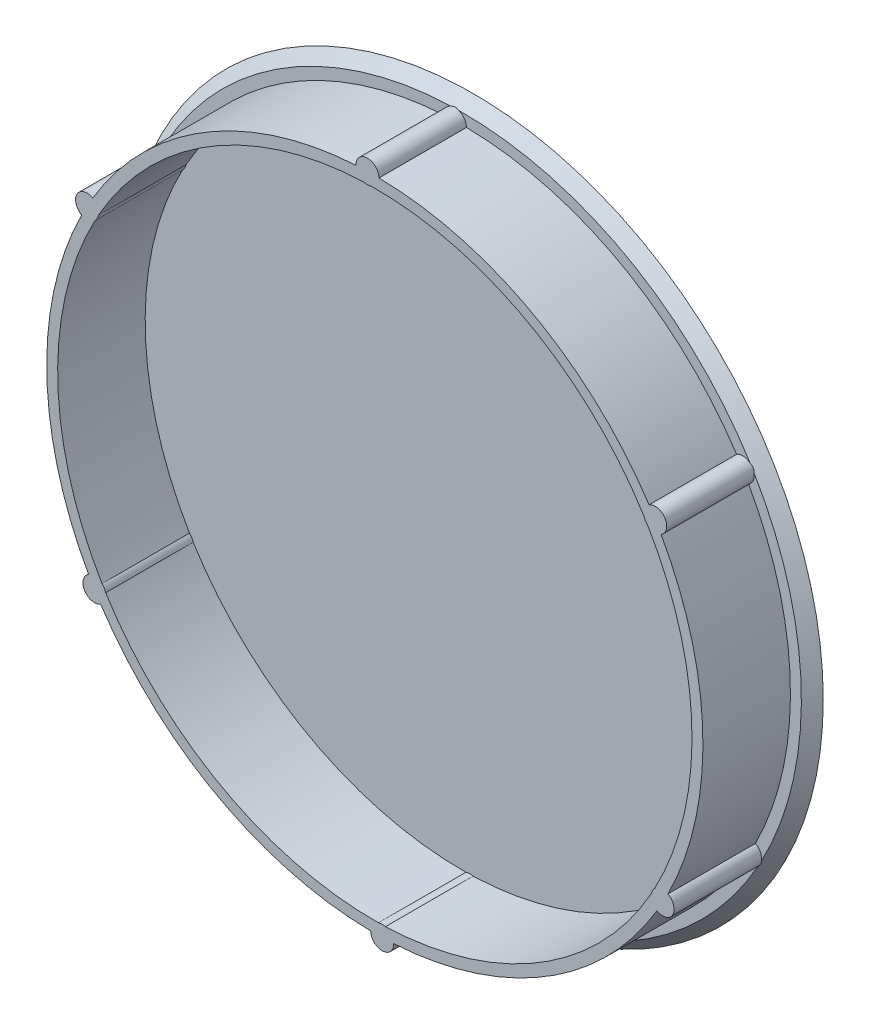
ISO-10303-21;
HEADER;
FILE_DESCRIPTION(('STEP AP214'),'2;1');
FILE_NAME('part.step','',(''),(''),'','','');
FILE_SCHEMA(('AUTOMOTIVE_DESIGN { 1 0 10303 214 1 1 1 1 }'));
ENDSEC;
DATA;
#1=APPLICATION_CONTEXT('core data for automotive mechanical design processes');
#2=APPLICATION_PROTOCOL_DEFINITION('international standard','automotive_design',2000,#1);
#3=PRODUCT_CONTEXT('',#1,'mechanical');
#4=PRODUCT('Part','Part','',(#3));
#5=PRODUCT_RELATED_PRODUCT_CATEGORY('part','',(#4));
#6=PRODUCT_DEFINITION_FORMATION('','',#4);
#7=PRODUCT_DEFINITION_CONTEXT('part definition',#1,'design');
#8=PRODUCT_DEFINITION('design','',#6,#7);
#9=PRODUCT_DEFINITION_SHAPE('','',#8);
#10=(LENGTH_UNIT() NAMED_UNIT(*) SI_UNIT(.MILLI.,.METRE.));
#11=(NAMED_UNIT(*) PLANE_ANGLE_UNIT() SI_UNIT($,.RADIAN.));
#12=(NAMED_UNIT(*) SI_UNIT($,.STERADIAN.) SOLID_ANGLE_UNIT());
#13=UNCERTAINTY_MEASURE_WITH_UNIT(LENGTH_MEASURE(1.E-05),#10,'distance_accuracy_value','');
#14=(GEOMETRIC_REPRESENTATION_CONTEXT(3) GLOBAL_UNCERTAINTY_ASSIGNED_CONTEXT((#13)) GLOBAL_UNIT_ASSIGNED_CONTEXT((#10,
#11,#12)) REPRESENTATION_CONTEXT('',''));
#15=CARTESIAN_POINT('',(0.,0.,0.));
#16=DIRECTION('',(0.,0.,1.));
#17=DIRECTION('',(1.,0.,0.));
#18=AXIS2_PLACEMENT_3D('',#15,#16,#17);
#19=CARTESIAN_POINT('',(-36.0124263888669,0.,-8.18963149384611));
#20=DIRECTION('',(0.,0.,1.));
#21=DIRECTION('',(1.,0.,0.));
#22=AXIS2_PLACEMENT_3D('',#19,#20,#21);
#23=PLANE('',#22);
#24=CARTESIAN_POINT('',(19.624258490425,15.5807698269335,-8.18963149384611));
#25=DIRECTION('',(0.,0.,1.));
#26=DIRECTION('',(1.,0.,0.));
#27=AXIS2_PLACEMENT_3D('',#24,#25,#26);
#28=CIRCLE('',#27,1.05187214555238);
#29=CARTESIAN_POINT('',(19.0622846736642,16.4699382248562,-8.18963149384611));
#30=VERTEX_POINT('',#29);
#31=CARTESIAN_POINT('',(20.3050627468088,16.3826055801141,-8.18963149384611));
#32=VERTEX_POINT('',#31);
#33=EDGE_CURVE('E506',#30,#32,#28,.F.);
#34=ORIENTED_EDGE('',*,*,#33,.T.);
#35=CARTESIAN_POINT('',(-6.01242638886693,0.,-8.18963149384611));
#36=DIRECTION('',(0.,0.,1.));
#37=DIRECTION('',(1.,0.,0.));
#38=AXIS2_PLACEMENT_3D('',#35,#36,#37);
#39=CIRCLE('',#38,31.);
#40=CARTESIAN_POINT('',(-6.37833860260875,30.9978403804496,-8.18963149384611));
#41=VERTEX_POINT('',#40);
#42=EDGE_CURVE('E332',#32,#41,#39,.T.);
#43=ORIENTED_EDGE('',*,*,#42,.T.);
#44=CARTESIAN_POINT('',(-6.68742642986354,29.99240528775,-8.18963149384611));
#45=DIRECTION('',(0.,0.,1.));
#46=DIRECTION('',(1.,0.,0.));
#47=AXIS2_PLACEMENT_3D('',#44,#45,#46);
#48=CIRCLE('',#47,1.05187214555238);
#49=CARTESIAN_POINT('',(-5.6355672743315,29.997632860074,-8.18963149384611));
#50=VERTEX_POINT('',#49);
#51=EDGE_CURVE('E519',#41,#50,#48,.F.);
#52=ORIENTED_EDGE('',*,*,#51,.T.);
#53=CARTESIAN_POINT('',(-6.01242638886693,0.,-8.18963149384611));
#54=DIRECTION('',(0.,0.,-1.));
#55=DIRECTION('',(-1.,0.,0.));
#56=AXIS2_PLACEMENT_3D('',#53,#54,#55);
#57=CIRCLE('',#56,30.);
#58=EDGE_CURVE('E527',#50,#30,#57,.T.);
#59=ORIENTED_EDGE('',*,*,#58,.T.);
#60=EDGE_LOOP('',(#34,#43,#52,#59));
#61=FACE_BOUND('',#60,.T.);
#62=ADVANCED_FACE('F37',(#61),#23,.T.);
#63=CARTESIAN_POINT('',(-7.73845575908724,29.9503058851347,-8.18963149384611));
#64=VERTEX_POINT('',#63);
#65=CARTESIAN_POINT('',(-7.04143443358864,30.9829169453733,-8.18963149384611));
#66=VERTEX_POINT('',#65);
#67=EDGE_CURVE('E522',#64,#66,#48,.F.);
#68=ORIENTED_EDGE('',*,*,#67,.T.);
#69=CARTESIAN_POINT('',(-6.01242638886693,0.,-8.18963149384611));
#70=DIRECTION('',(0.,0.,1.));
#71=DIRECTION('',(1.,0.,0.));
#72=AXIS2_PLACEMENT_3D('',#69,#70,#71);
#73=CIRCLE('',#72,31.);
#74=CARTESIAN_POINT('',(-33.0402997276621,15.1820309175697,-8.18963149384611));
#75=VERTEX_POINT('',#74);
#76=EDGE_CURVE('E330',#66,#75,#73,.T.);
#77=ORIENTED_EDGE('',*,*,#76,.T.);
#78=CARTESIAN_POINT('',(-32.3241113091553,14.4116354608167,-8.18963149384611));
#79=DIRECTION('',(0.,0.,1.));
#80=DIRECTION('',(1.,0.,0.));
#81=AXIS2_PLACEMENT_3D('',#78,#79,#80);
#82=CIRCLE('',#81,1.05187214555238);
#83=CARTESIAN_POINT('',(-31.8027089418219,15.3251859968728,-8.18963149384611));
#84=VERTEX_POINT('',#83);
#85=EDGE_CURVE('E271',#75,#84,#82,.F.);
#86=ORIENTED_EDGE('',*,*,#85,.T.);
#87=EDGE_CURVE('E526',#84,#64,#57,.T.);
#88=ORIENTED_EDGE('',*,*,#87,.T.);
#89=EDGE_LOOP('',(#68,#77,#86,#88));
#90=FACE_BOUND('',#89,.T.);
#91=ADVANCED_FACE('F387',(#90),#23,.T.);
#92=CARTESIAN_POINT('',(-32.8131668216182,13.4803676602788,-8.18963149384611));
#93=VERTEX_POINT('',#92);
#94=CARTESIAN_POINT('',(-33.3589235692642,14.6003113652594,-8.18963149384611));
#95=VERTEX_POINT('',#94);
#96=EDGE_CURVE('E269',#93,#95,#82,.F.);
#97=ORIENTED_EDGE('',*,*,#96,.T.);
#98=CARTESIAN_POINT('',(-6.01242638886693,0.,-8.18963149384611));
#99=DIRECTION('',(0.,0.,1.));
#100=DIRECTION('',(1.,0.,0.));
#101=AXIS2_PLACEMENT_3D('',#98,#99,#100);
#102=CIRCLE('',#101,31.);
#103=CARTESIAN_POINT('',(-32.6743875139206,-15.81580946288,-8.18963149384611));
#104=VERTEX_POINT('',#103);
#105=EDGE_CURVE('E59',#95,#104,#102,.T.);
#106=ORIENTED_EDGE('',*,*,#105,.T.);
#107=CARTESIAN_POINT('',(-31.649111268159,-15.5807698269334,-8.18963149384611));
#108=DIRECTION('',(0.,0.,1.));
#109=DIRECTION('',(1.,0.,0.));
#110=AXIS2_PLACEMENT_3D('',#107,#108,#109);
#111=CIRCLE('',#110,1.05187214555238);
#112=CARTESIAN_POINT('',(-32.1795680563578,-14.6724468632013,-8.18963149384611));
#113=VERTEX_POINT('',#112);
#114=EDGE_CURVE('E548',#104,#113,#111,.F.);
#115=ORIENTED_EDGE('',*,*,#114,.T.);
#116=EDGE_CURVE('E457',#113,#93,#57,.T.);
#117=ORIENTED_EDGE('',*,*,#116,.T.);
#118=EDGE_LOOP('',(#97,#106,#115,#117));
#119=FACE_BOUND('',#118,.T.);
#120=ADVANCED_FACE('F397',(#119),#23,.T.);
#121=CARTESIAN_POINT('',(-31.0871374513982,-16.469938224856,-8.18963149384611));
#122=VERTEX_POINT('',#121);
#123=CARTESIAN_POINT('',(-32.3299155245428,-16.3826055801139,-8.18963149384611));
#124=VERTEX_POINT('',#123);
#125=EDGE_CURVE('E461',#122,#124,#111,.F.);
#126=ORIENTED_EDGE('',*,*,#125,.T.);
#127=CARTESIAN_POINT('',(-6.01242638886693,0.,-8.18963149384611));
#128=DIRECTION('',(0.,0.,1.));
#129=DIRECTION('',(1.,0.,0.));
#130=AXIS2_PLACEMENT_3D('',#127,#128,#129);
#131=CIRCLE('',#130,31.);
#132=CARTESIAN_POINT('',(-5.64651417512511,-30.9978403804496,-8.18963149384611));
#133=VERTEX_POINT('',#132);
#134=EDGE_CURVE('E327',#124,#133,#131,.T.);
#135=ORIENTED_EDGE('',*,*,#134,.T.);
#136=CARTESIAN_POINT('',(-5.33742634787033,-29.99240528775,-8.18963149384611));
#137=DIRECTION('',(0.,0.,1.));
#138=DIRECTION('',(1.,0.,0.));
#139=AXIS2_PLACEMENT_3D('',#136,#137,#138);
#140=CIRCLE('',#139,1.05187214555238);
#141=CARTESIAN_POINT('',(-6.38928550340247,-29.997632860074,-8.18963149384611));
#142=VERTEX_POINT('',#141);
#143=EDGE_CURVE('E410',#133,#142,#140,.F.);
#144=ORIENTED_EDGE('',*,*,#143,.T.);
#145=EDGE_CURVE('E536',#142,#122,#57,.T.);
#146=ORIENTED_EDGE('',*,*,#145,.T.);
#147=EDGE_LOOP('',(#126,#135,#144,#146));
#148=FACE_BOUND('',#147,.T.);
#149=ADVANCED_FACE('F390',(#148),#23,.T.);
#150=CARTESIAN_POINT('',(-4.28639701864663,-29.9503058851347,-8.18963149384611));
#151=VERTEX_POINT('',#150);
#152=CARTESIAN_POINT('',(-4.98341834414522,-30.9829169453733,-8.18963149384611));
#153=VERTEX_POINT('',#152);
#154=EDGE_CURVE('E401',#151,#153,#140,.F.);
#155=ORIENTED_EDGE('',*,*,#154,.T.);
#156=CARTESIAN_POINT('',(-6.01242638886693,0.,-8.18963149384611));
#157=DIRECTION('',(0.,0.,1.));
#158=DIRECTION('',(1.,0.,0.));
#159=AXIS2_PLACEMENT_3D('',#156,#157,#158);
#160=CIRCLE('',#159,31.);
#161=CARTESIAN_POINT('',(21.0154469499284,-15.1820309175695,-8.18963149384611));
#162=VERTEX_POINT('',#161);
#163=EDGE_CURVE('E325',#153,#162,#160,.T.);
#164=ORIENTED_EDGE('',*,*,#163,.T.);
#165=CARTESIAN_POINT('',(20.2992585314215,-14.4116354608165,-8.18963149384611));
#166=DIRECTION('',(0.,0.,1.));
#167=DIRECTION('',(1.,0.,0.));
#168=AXIS2_PLACEMENT_3D('',#165,#166,#167);
#169=CIRCLE('',#168,1.05187214555238);
#170=CARTESIAN_POINT('',(19.7778561640882,-15.3251859968726,-8.18963149384611));
#171=VERTEX_POINT('',#170);
#172=EDGE_CURVE('E485',#162,#171,#169,.F.);
#173=ORIENTED_EDGE('',*,*,#172,.T.);
#174=EDGE_CURVE('E405',#171,#151,#57,.T.);
#175=ORIENTED_EDGE('',*,*,#174,.T.);
#176=EDGE_LOOP('',(#155,#164,#173,#175));
#177=FACE_BOUND('',#176,.T.);
#178=ADVANCED_FACE('F379',(#177),#23,.T.);
#179=CARTESIAN_POINT('',(-6.01242638886693,0.,-9.18963149384611));
#180=DIRECTION('',(0.,0.,-1.));
#181=DIRECTION('',(-1.,0.,0.));
#182=AXIS2_PLACEMENT_3D('',#179,#180,#181);
#183=CYLINDRICAL_SURFACE('',#182,29.);
#184=DIRECTION('',(0.,0.,1.));
#185=VECTOR('',#184,1.);
#186=CARTESIAN_POINT('',(-31.2914123212657,14.2117159495108,-4.18963149384611));
#187=LINE('',#186,#185);
#188=CARTESIAN_POINT('',(-31.2914123212657,14.2117159495108,-8.18963149384611));
#189=VERTEX_POINT('',#188);
#190=CARTESIAN_POINT('',(-31.2914123212658,14.2117159495108,-0.189631493846106));
#191=VERTEX_POINT('',#190);
#192=EDGE_CURVE('E257',#189,#191,#187,.T.);
#193=ORIENTED_EDGE('',*,*,#192,.F.);
#194=CARTESIAN_POINT('',(-6.01242638886693,0.,-8.18963149384611));
#195=DIRECTION('',(0.,0.,-1.));
#196=DIRECTION('',(-1.,0.,0.));
#197=AXIS2_PLACEMENT_3D('',#194,#195,#196);
#198=CIRCLE('',#197,29.);
#199=CARTESIAN_POINT('',(-6.9855607193096,28.9836679800006,-8.18963149384611));
#200=VERTEX_POINT('',#199);
#201=EDGE_CURVE('E241',#189,#200,#198,.T.);
#202=ORIENTED_EDGE('',*,*,#201,.T.);
#203=DIRECTION('',(0.,0.,1.));
#204=VECTOR('',#203,1.);
#205=CARTESIAN_POINT('',(-6.98556071930954,28.9836679800006,-4.18963149384611));
#206=LINE('',#205,#204);
#207=CARTESIAN_POINT('',(-6.98556071930954,28.9836679800006,-0.189631493846105));
#208=VERTEX_POINT('',#207);
#209=EDGE_CURVE('E521',#208,#200,#206,.F.);
#210=ORIENTED_EDGE('',*,*,#209,.F.);
#211=CARTESIAN_POINT('',(-6.01242638886693,0.,-0.189631493846106));
#212=DIRECTION('',(0.,0.,-1.));
#213=DIRECTION('',(-1.,0.,0.));
#214=AXIS2_PLACEMENT_3D('',#211,#212,#213);
#215=CIRCLE('',#214,29.);
#216=EDGE_CURVE('E259',#191,#208,#215,.T.);
#217=ORIENTED_EDGE('',*,*,#216,.F.);
#218=EDGE_LOOP('',(#193,#202,#210,#217));
#219=FACE_BOUND('',#218,.T.);
#220=ADVANCED_FACE('F258',(#219),#183,.F.);
#221=CARTESIAN_POINT('',(-6.01242638886693,0.,-9.18963149384611));
#222=DIRECTION('',(0.,0.,-1.));
#223=DIRECTION('',(-1.,0.,0.));
#224=AXIS2_PLACEMENT_3D('',#221,#222,#223);
#225=CYLINDRICAL_SURFACE('',#224,30.);
#226=DIRECTION('',(0.,0.,1.));
#227=VECTOR('',#226,1.);
#228=CARTESIAN_POINT('',(-31.802708941822,15.3251859968727,-4.18963149384611));
#229=LINE('',#228,#227);
#230=CARTESIAN_POINT('',(-31.8027089418219,15.3251859968728,-0.189631493846106));
#231=VERTEX_POINT('',#230);
#232=EDGE_CURVE('E273',#231,#84,#229,.F.);
#233=ORIENTED_EDGE('',*,*,#232,.F.);
#234=CARTESIAN_POINT('',(-6.01242638886693,0.,-0.189631493846106));
#235=DIRECTION('',(0.,0.,-1.));
#236=DIRECTION('',(-1.,0.,0.));
#237=AXIS2_PLACEMENT_3D('',#234,#235,#236);
#238=CIRCLE('',#237,30.);
#239=CARTESIAN_POINT('',(-7.73845575908724,29.9503058851347,-0.189631493846106));
#240=VERTEX_POINT('',#239);
#241=EDGE_CURVE('E529',#231,#240,#238,.T.);
#242=ORIENTED_EDGE('',*,*,#241,.T.);
#243=DIRECTION('',(0.,0.,1.));
#244=VECTOR('',#243,1.);
#245=CARTESIAN_POINT('',(-7.73845575908724,29.9503058851347,-4.18963149384611));
#246=LINE('',#245,#244);
#247=EDGE_CURVE('E307',#64,#240,#246,.T.);
#248=ORIENTED_EDGE('',*,*,#247,.F.);
#249=ORIENTED_EDGE('',*,*,#87,.F.);
#250=EDGE_LOOP('',(#233,#242,#248,#249));
#251=FACE_BOUND('',#250,.T.);
#252=ADVANCED_FACE('F362',(#251),#225,.T.);
#253=DIRECTION('',(0.,0.,1.));
#254=VECTOR('',#253,1.);
#255=CARTESIAN_POINT('',(-31.5995863196221,13.6490749385427,-4.18963149384611));
#256=LINE('',#255,#254);
#257=CARTESIAN_POINT('',(-31.5995863196221,13.6490749385427,-0.189631493846106));
#258=VERTEX_POINT('',#257);
#259=CARTESIAN_POINT('',(-31.5995863196221,13.6490749385427,-8.18963149384611));
#260=VERTEX_POINT('',#259);
#261=EDGE_CURVE('E264',#258,#260,#256,.F.);
#262=ORIENTED_EDGE('',*,*,#261,.F.);
#263=CARTESIAN_POINT('',(-30.9596263987113,-14.7863860246114,-0.189631493846106));
#264=VERTEX_POINT('',#263);
#265=EDGE_CURVE('E291',#264,#258,#215,.T.);
#266=ORIENTED_EDGE('',*,*,#265,.F.);
#267=DIRECTION('',(0.,0.,1.));
#268=VECTOR('',#267,1.);
#269=CARTESIAN_POINT('',(-30.9596263987113,-14.7863860246113,-4.18963149384611));
#270=LINE('',#269,#268);
#271=CARTESIAN_POINT('',(-30.9596263987113,-14.7863860246113,-8.18963149384611));
#272=VERTEX_POINT('',#271);
#273=EDGE_CURVE('E826',#272,#264,#270,.T.);
#274=ORIENTED_EDGE('',*,*,#273,.F.);
#275=EDGE_CURVE('E252',#272,#260,#198,.T.);
#276=ORIENTED_EDGE('',*,*,#275,.T.);
#277=EDGE_LOOP('',(#262,#266,#274,#276));
#278=FACE_BOUND('',#277,.T.);
#279=ADVANCED_FACE('F396',(#278),#183,.F.);
#280=DIRECTION('',(0.,0.,1.));
#281=VECTOR('',#280,1.);
#282=CARTESIAN_POINT('',(-32.8131668216182,13.4803676602788,-4.18963149384611));
#283=LINE('',#282,#281);
#284=CARTESIAN_POINT('',(-32.8131668216182,13.4803676602787,-0.189631493846106));
#285=VERTEX_POINT('',#284);
#286=EDGE_CURVE('E268',#93,#285,#283,.T.);
#287=ORIENTED_EDGE('',*,*,#286,.F.);
#288=ORIENTED_EDGE('',*,*,#116,.F.);
#289=DIRECTION('',(0.,0.,1.));
#290=VECTOR('',#289,1.);
#291=CARTESIAN_POINT('',(-32.1795680563577,-14.6724468632014,-4.18963149384611));
#292=LINE('',#291,#290);
#293=CARTESIAN_POINT('',(-32.1795680563578,-14.6724468632013,-0.189631493846106));
#294=VERTEX_POINT('',#293);
#295=EDGE_CURVE('E546',#294,#113,#292,.F.);
#296=ORIENTED_EDGE('',*,*,#295,.F.);
#297=EDGE_CURVE('E533',#294,#285,#238,.T.);
#298=ORIENTED_EDGE('',*,*,#297,.T.);
#299=EDGE_LOOP('',(#287,#288,#296,#298));
#300=FACE_BOUND('',#299,.T.);
#301=ADVANCED_FACE('F764',(#300),#225,.T.);
#302=DIRECTION('',(0.,0.,1.));
#303=VECTOR('',#302,1.);
#304=CARTESIAN_POINT('',(-30.6264519891799,-15.3345930414581,-4.18963149384611));
#305=LINE('',#304,#303);
#306=CARTESIAN_POINT('',(-30.6264519891799,-15.3345930414581,-0.189631493846106));
#307=VERTEX_POINT('',#306);
#308=CARTESIAN_POINT('',(-30.6264519891799,-15.3345930414581,-8.18963149384611));
#309=VERTEX_POINT('',#308);
#310=EDGE_CURVE('E827',#307,#309,#305,.F.);
#311=ORIENTED_EDGE('',*,*,#310,.F.);
#312=CARTESIAN_POINT('',(-5.68064046631221,-28.9981019741223,-0.189631493846106));
#313=VERTEX_POINT('',#312);
#314=EDGE_CURVE('E297',#313,#307,#215,.T.);
#315=ORIENTED_EDGE('',*,*,#314,.F.);
#316=DIRECTION('',(0.,0.,1.));
#317=VECTOR('',#316,1.);
#318=CARTESIAN_POINT('',(-5.68064046631222,-28.9981019741223,-4.18963149384611));
#319=LINE('',#318,#317);
#320=CARTESIAN_POINT('',(-5.68064046631222,-28.9981019741223,-8.18963149384611));
#321=VERTEX_POINT('',#320);
#322=EDGE_CURVE('E478',#321,#313,#319,.T.);
#323=ORIENTED_EDGE('',*,*,#322,.F.);
#324=EDGE_CURVE('E835',#321,#309,#198,.T.);
#325=ORIENTED_EDGE('',*,*,#324,.T.);
#326=EDGE_LOOP('',(#311,#315,#323,#325));
#327=FACE_BOUND('',#326,.T.);
#328=ADVANCED_FACE('F756',(#327),#183,.F.);
#329=DIRECTION('',(0.,0.,1.));
#330=VECTOR('',#329,1.);
#331=CARTESIAN_POINT('',(-31.0871374513982,-16.469938224856,-4.18963149384611));
#332=LINE('',#331,#330);
#333=CARTESIAN_POINT('',(-31.0871374513981,-16.4699382248561,-0.189631493846106));
#334=VERTEX_POINT('',#333);
#335=EDGE_CURVE('E540',#122,#334,#332,.T.);
#336=ORIENTED_EDGE('',*,*,#335,.F.);
#337=ORIENTED_EDGE('',*,*,#145,.F.);
#338=DIRECTION('',(0.,0.,1.));
#339=VECTOR('',#338,1.);
#340=CARTESIAN_POINT('',(-6.38928550340236,-29.997632860074,-4.18963149384611));
#341=LINE('',#340,#339);
#342=CARTESIAN_POINT('',(-6.38928550340247,-29.997632860074,-0.189631493846106));
#343=VERTEX_POINT('',#342);
#344=EDGE_CURVE('E464',#343,#142,#341,.F.);
#345=ORIENTED_EDGE('',*,*,#344,.F.);
#346=EDGE_CURVE('E543',#343,#334,#238,.T.);
#347=ORIENTED_EDGE('',*,*,#346,.T.);
#348=EDGE_LOOP('',(#336,#337,#345,#347));
#349=FACE_BOUND('',#348,.T.);
#350=ADVANCED_FACE('F541',(#349),#225,.T.);
#351=DIRECTION('',(0.,0.,1.));
#352=VECTOR('',#351,1.);
#353=CARTESIAN_POINT('',(-5.03929205842433,-28.9836679800006,-4.18963149384611));
#354=LINE('',#353,#352);
#355=CARTESIAN_POINT('',(-5.03929205842433,-28.9836679800006,-0.189631493846106));
#356=VERTEX_POINT('',#355);
#357=CARTESIAN_POINT('',(-5.03929205842433,-28.9836679800006,-8.18963149384611));
#358=VERTEX_POINT('',#357);
#359=EDGE_CURVE('E473',#356,#358,#354,.F.);
#360=ORIENTED_EDGE('',*,*,#359,.F.);
#361=CARTESIAN_POINT('',(19.266559543532,-14.2117159495107,-0.189631493846106));
#362=VERTEX_POINT('',#361);
#363=EDGE_CURVE('E299',#362,#356,#215,.T.);
#364=ORIENTED_EDGE('',*,*,#363,.F.);
#365=DIRECTION('',(0.,0.,1.));
#366=VECTOR('',#365,1.);
#367=CARTESIAN_POINT('',(19.2665595435319,-14.2117159495107,-4.18963149384611));
#368=LINE('',#367,#366);
#369=CARTESIAN_POINT('',(19.2665595435319,-14.2117159495107,-8.18963149384611));
#370=VERTEX_POINT('',#369);
#371=EDGE_CURVE('E498',#370,#362,#368,.T.);
#372=ORIENTED_EDGE('',*,*,#371,.F.);
#373=EDGE_CURVE('E834',#370,#358,#198,.T.);
#374=ORIENTED_EDGE('',*,*,#373,.T.);
#375=EDGE_LOOP('',(#360,#364,#372,#374));
#376=FACE_BOUND('',#375,.T.);
#377=ADVANCED_FACE('F739',(#376),#183,.F.);
#378=DIRECTION('',(0.,0.,1.));
#379=VECTOR('',#378,1.);
#380=CARTESIAN_POINT('',(-4.28639701864663,-29.9503058851347,-4.18963149384611));
#381=LINE('',#380,#379);
#382=CARTESIAN_POINT('',(-4.28639701864653,-29.9503058851347,-0.189631493846106));
#383=VERTEX_POINT('',#382);
#384=EDGE_CURVE('E470',#151,#383,#381,.T.);
#385=ORIENTED_EDGE('',*,*,#384,.F.);
#386=ORIENTED_EDGE('',*,*,#174,.F.);
#387=DIRECTION('',(0.,0.,1.));
#388=VECTOR('',#387,1.);
#389=CARTESIAN_POINT('',(19.7778561640882,-15.3251859968725,-4.18963149384611));
#390=LINE('',#389,#388);
#391=CARTESIAN_POINT('',(19.7778561640882,-15.3251859968726,-0.189631493846106));
#392=VERTEX_POINT('',#391);
#393=EDGE_CURVE('E492',#392,#171,#390,.F.);
#394=ORIENTED_EDGE('',*,*,#393,.F.);
#395=EDGE_CURVE('E570',#392,#383,#238,.T.);
#396=ORIENTED_EDGE('',*,*,#395,.T.);
#397=EDGE_LOOP('',(#385,#386,#394,#396));
#398=FACE_BOUND('',#397,.T.);
#399=ADVANCED_FACE('F384',(#398),#225,.T.);
#400=DIRECTION('',(0.,0.,1.));
#401=VECTOR('',#400,1.);
#402=CARTESIAN_POINT('',(19.5747335418883,-13.6490749385425,-4.18963149384611));
#403=LINE('',#402,#401);
#404=CARTESIAN_POINT('',(19.5747335418884,-13.6490749385425,-0.189631493846106));
#405=VERTEX_POINT('',#404);
#406=CARTESIAN_POINT('',(19.5747335418884,-13.6490749385425,-8.18963149384611));
#407=VERTEX_POINT('',#406);
#408=EDGE_CURVE('E495',#405,#407,#403,.F.);
#409=ORIENTED_EDGE('',*,*,#408,.F.);
#410=CARTESIAN_POINT('',(18.9347736209773,14.7863860246115,-0.189631493846106));
#411=VERTEX_POINT('',#410);
#412=EDGE_CURVE('E303',#411,#405,#215,.T.);
#413=ORIENTED_EDGE('',*,*,#412,.F.);
#414=DIRECTION('',(0.,0.,1.));
#415=VECTOR('',#414,1.);
#416=CARTESIAN_POINT('',(18.9347736209773,14.7863860246115,-4.18963149384611));
#417=LINE('',#416,#415);
#418=CARTESIAN_POINT('',(18.9347736209774,14.7863860246115,-8.18963149384611));
#419=VERTEX_POINT('',#418);
#420=EDGE_CURVE('E512',#419,#411,#417,.T.);
#421=ORIENTED_EDGE('',*,*,#420,.F.);
#422=EDGE_CURVE('E308',#419,#407,#198,.T.);
#423=ORIENTED_EDGE('',*,*,#422,.T.);
#424=EDGE_LOOP('',(#409,#413,#421,#423));
#425=FACE_BOUND('',#424,.T.);
#426=ADVANCED_FACE('F370',(#425),#183,.F.);
#427=DIRECTION('',(0.,0.,1.));
#428=VECTOR('',#427,1.);
#429=CARTESIAN_POINT('',(20.7883140438844,-13.4803676602787,-4.18963149384611));
#430=LINE('',#429,#428);
#431=CARTESIAN_POINT('',(20.7883140438844,-13.4803676602787,-8.18963149384611));
#432=VERTEX_POINT('',#431);
#433=CARTESIAN_POINT('',(20.7883140438845,-13.4803676602786,-0.189631493846106));
#434=VERTEX_POINT('',#433);
#435=EDGE_CURVE('E489',#432,#434,#430,.T.);
#436=ORIENTED_EDGE('',*,*,#435,.F.);
#437=CARTESIAN_POINT('',(20.1547152786238,14.6724468632016,-8.18963149384611));
#438=VERTEX_POINT('',#437);
#439=EDGE_CURVE('E530',#438,#432,#57,.T.);
#440=ORIENTED_EDGE('',*,*,#439,.F.);
#441=DIRECTION('',(0.,0.,1.));
#442=VECTOR('',#441,1.);
#443=CARTESIAN_POINT('',(20.1547152786237,14.6724468632016,-4.18963149384611));
#444=LINE('',#443,#442);
#445=CARTESIAN_POINT('',(20.1547152786237,14.6724468632015,-0.189631493846105));
#446=VERTEX_POINT('',#445);
#447=EDGE_CURVE('E317',#446,#438,#444,.F.);
#448=ORIENTED_EDGE('',*,*,#447,.F.);
#449=EDGE_CURVE('E565',#446,#434,#238,.T.);
#450=ORIENTED_EDGE('',*,*,#449,.T.);
#451=EDGE_LOOP('',(#436,#440,#448,#450));
#452=FACE_BOUND('',#451,.T.);
#453=ADVANCED_FACE('F363',(#452),#225,.T.);
#454=CARTESIAN_POINT('',(21.3340707915305,-14.6003113652592,-8.18963149384611));
#455=VERTEX_POINT('',#454);
#456=EDGE_CURVE('E486',#432,#455,#169,.F.);
#457=ORIENTED_EDGE('',*,*,#456,.T.);
#458=CARTESIAN_POINT('',(-6.01242638886693,0.,-8.18963149384611));
#459=DIRECTION('',(0.,0.,1.));
#460=DIRECTION('',(1.,0.,0.));
#461=AXIS2_PLACEMENT_3D('',#458,#459,#460);
#462=CIRCLE('',#461,31.);
#463=CARTESIAN_POINT('',(20.6495347361867,15.8158094628802,-8.18963149384611));
#464=VERTEX_POINT('',#463);
#465=EDGE_CURVE('E323',#455,#464,#462,.T.);
#466=ORIENTED_EDGE('',*,*,#465,.T.);
#467=EDGE_CURVE('E505',#464,#438,#28,.F.);
#468=ORIENTED_EDGE('',*,*,#467,.T.);
#469=ORIENTED_EDGE('',*,*,#439,.T.);
#470=EDGE_LOOP('',(#457,#466,#468,#469));
#471=FACE_BOUND('',#470,.T.);
#472=ADVANCED_FACE('F375',(#471),#23,.T.);
#473=CARTESIAN_POINT('',(-39.0124263888669,0.,-9.18963149384611));
#474=DIRECTION('',(0.,0.,-1.));
#475=DIRECTION('',(-1.,0.,0.));
#476=AXIS2_PLACEMENT_3D('',#473,#474,#475);
#477=PLANE('',#476);
#478=CARTESIAN_POINT('',(-6.01242638886693,0.,-9.18963149384611));
#479=DIRECTION('',(0.,0.,-1.));
#480=DIRECTION('',(-1.,0.,0.));
#481=AXIS2_PLACEMENT_3D('',#478,#479,#480);
#482=CIRCLE('',#481,32.);
#483=CARTESIAN_POINT('',(-38.0124263888669,0.,-9.18963149384611));
#484=VERTEX_POINT('',#483);
#485=EDGE_CURVE('E320',#484,#484,#482,.T.);
#486=ORIENTED_EDGE('',*,*,#485,.T.);
#487=EDGE_LOOP('',(#486));
#488=FACE_BOUND('',#487,.T.);
#489=ADVANCED_FACE('F373',(#488),#477,.T.);
#490=CARTESIAN_POINT('',(-6.01242638886693,0.,-8.18963149384611));
#491=DIRECTION('',(0.,0.,1.));
#492=DIRECTION('',(1.,0.,0.));
#493=AXIS2_PLACEMENT_3D('',#490,#491,#492);
#494=PLANE('',#493);
#495=EDGE_CURVE('E245',#189,#260,#82,.F.);
#496=ORIENTED_EDGE('',*,*,#495,.T.);
#497=ORIENTED_EDGE('',*,*,#275,.F.);
#498=EDGE_CURVE('E550',#272,#309,#111,.F.);
#499=ORIENTED_EDGE('',*,*,#498,.T.);
#500=ORIENTED_EDGE('',*,*,#324,.F.);
#501=EDGE_CURVE('E409',#321,#358,#140,.F.);
#502=ORIENTED_EDGE('',*,*,#501,.T.);
#503=ORIENTED_EDGE('',*,*,#373,.F.);
#504=EDGE_CURVE('E488',#370,#407,#169,.F.);
#505=ORIENTED_EDGE('',*,*,#504,.T.);
#506=ORIENTED_EDGE('',*,*,#422,.F.);
#507=CARTESIAN_POINT('',(18.6015992114459,15.3345930414584,-8.18963149384611));
#508=VERTEX_POINT('',#507);
#509=EDGE_CURVE('E509',#419,#508,#28,.F.);
#510=ORIENTED_EDGE('',*,*,#509,.T.);
#511=CARTESIAN_POINT('',(-6.34421231142158,28.9981019741223,-8.18963149384611));
#512=VERTEX_POINT('',#511);
#513=EDGE_CURVE('E255',#512,#508,#198,.T.);
#514=ORIENTED_EDGE('',*,*,#513,.F.);
#515=EDGE_CURVE('E248',#512,#200,#48,.F.);
#516=ORIENTED_EDGE('',*,*,#515,.T.);
#517=ORIENTED_EDGE('',*,*,#201,.F.);
#518=EDGE_LOOP('',(#496,#497,#499,#500,#502,#503,#505,#506,#510,#514,#516,#517));
#519=FACE_BOUND('',#518,.T.);
#520=ADVANCED_FACE('F243',(#519),#494,.T.);
#521=DIRECTION('',(0.,0.,1.));
#522=VECTOR('',#521,1.);
#523=CARTESIAN_POINT('',(18.6015992114459,15.3345930414583,-4.18963149384611));
#524=LINE('',#523,#522);
#525=CARTESIAN_POINT('',(18.6015992114459,15.3345930414583,-0.189631493846105));
#526=VERTEX_POINT('',#525);
#527=EDGE_CURVE('E510',#526,#508,#524,.F.);
#528=ORIENTED_EDGE('',*,*,#527,.F.);
#529=CARTESIAN_POINT('',(-6.34421231142165,28.9981019741223,-0.189631493846106));
#530=VERTEX_POINT('',#529);
#531=EDGE_CURVE('E253',#530,#526,#215,.T.);
#532=ORIENTED_EDGE('',*,*,#531,.F.);
#533=DIRECTION('',(0.,0.,1.));
#534=VECTOR('',#533,1.);
#535=CARTESIAN_POINT('',(-6.34421231142164,28.9981019741223,-4.18963149384611));
#536=LINE('',#535,#534);
#537=EDGE_CURVE('E524',#512,#530,#536,.T.);
#538=ORIENTED_EDGE('',*,*,#537,.F.);
#539=ORIENTED_EDGE('',*,*,#513,.T.);
#540=EDGE_LOOP('',(#528,#532,#538,#539));
#541=FACE_BOUND('',#540,.T.);
#542=ADVANCED_FACE('F366',(#541),#183,.F.);
#543=CARTESIAN_POINT('',(-35.0124263888669,0.,-0.189631493846105));
#544=DIRECTION('',(0.,0.,1.));
#545=DIRECTION('',(1.,0.,0.));
#546=AXIS2_PLACEMENT_3D('',#543,#544,#545);
#547=PLANE('',#546);
#548=ORIENTED_EDGE('',*,*,#265,.T.);
#549=CARTESIAN_POINT('',(-32.3241113091553,14.4116354608167,-0.189631493846105));
#550=DIRECTION('',(0.,0.,1.));
#551=DIRECTION('',(0.50000000000001,0.866025403784433,0.));
#552=AXIS2_PLACEMENT_3D('',#549,#550,#551);
#553=CIRCLE('',#552,1.05187214555238);
#554=EDGE_CURVE('E281',#258,#191,#553,.T.);
#555=ORIENTED_EDGE('',*,*,#554,.T.);
#556=ORIENTED_EDGE('',*,*,#216,.T.);
#557=CARTESIAN_POINT('',(-6.68742642986354,29.99240528775,-0.189631493846105));
#558=DIRECTION('',(0.,0.,1.));
#559=DIRECTION('',(1.,0.,0.));
#560=AXIS2_PLACEMENT_3D('',#557,#558,#559);
#561=CIRCLE('',#560,1.05187214555238);
#562=EDGE_CURVE('E515',#208,#530,#561,.T.);
#563=ORIENTED_EDGE('',*,*,#562,.T.);
#564=ORIENTED_EDGE('',*,*,#531,.T.);
#565=CARTESIAN_POINT('',(19.624258490425,15.5807698269335,-0.189631493846105));
#566=DIRECTION('',(0.,0.,1.));
#567=DIRECTION('',(0.499999999999998,-0.86602540378444,0.));
#568=AXIS2_PLACEMENT_3D('',#565,#566,#567);
#569=CIRCLE('',#568,1.05187214555238);
#570=EDGE_CURVE('E501',#526,#411,#569,.T.);
#571=ORIENTED_EDGE('',*,*,#570,.T.);
#572=ORIENTED_EDGE('',*,*,#412,.T.);
#573=CARTESIAN_POINT('',(20.2992585314215,-14.4116354608165,-0.189631493846105));
#574=DIRECTION('',(0.,0.,1.));
#575=DIRECTION('',(-0.500000000000004,-0.866025403784436,0.));
#576=AXIS2_PLACEMENT_3D('',#573,#574,#575);
#577=CIRCLE('',#576,1.05187214555238);
#578=EDGE_CURVE('E481',#405,#362,#577,.T.);
#579=ORIENTED_EDGE('',*,*,#578,.T.);
#580=ORIENTED_EDGE('',*,*,#363,.T.);
#581=CARTESIAN_POINT('',(-5.33742634787033,-29.99240528775,-0.189631493846105));
#582=DIRECTION('',(0.,0.,1.));
#583=DIRECTION('',(-1.,0.,0.));
#584=AXIS2_PLACEMENT_3D('',#581,#582,#583);
#585=CIRCLE('',#584,1.05187214555238);
#586=EDGE_CURVE('E467',#356,#313,#585,.T.);
#587=ORIENTED_EDGE('',*,*,#586,.T.);
#588=ORIENTED_EDGE('',*,*,#314,.T.);
#589=CARTESIAN_POINT('',(-31.649111268159,-15.5807698269334,-0.189631493846105));
#590=DIRECTION('',(0.,0.,1.));
#591=DIRECTION('',(-0.499999999999992,0.866025403784443,0.));
#592=AXIS2_PLACEMENT_3D('',#589,#590,#591);
#593=CIRCLE('',#592,1.05187214555238);
#594=EDGE_CURVE('E263',#307,#264,#593,.T.);
#595=ORIENTED_EDGE('',*,*,#594,.T.);
#596=EDGE_LOOP('',(#548,#555,#556,#563,#564,#571,#572,#579,#580,#587,#588,#595));
#597=FACE_BOUND('',#596,.T.);
#598=ORIENTED_EDGE('',*,*,#241,.F.);
#599=EDGE_CURVE('E276',#231,#285,#553,.T.);
#600=ORIENTED_EDGE('',*,*,#599,.T.);
#601=ORIENTED_EDGE('',*,*,#297,.F.);
#602=EDGE_CURVE('E552',#294,#334,#593,.T.);
#603=ORIENTED_EDGE('',*,*,#602,.T.);
#604=ORIENTED_EDGE('',*,*,#346,.F.);
#605=EDGE_CURVE('E465',#343,#383,#585,.T.);
#606=ORIENTED_EDGE('',*,*,#605,.T.);
#607=ORIENTED_EDGE('',*,*,#395,.F.);
#608=EDGE_CURVE('E482',#392,#434,#577,.T.);
#609=ORIENTED_EDGE('',*,*,#608,.T.);
#610=ORIENTED_EDGE('',*,*,#449,.F.);
#611=CARTESIAN_POINT('',(19.0622846736642,16.4699382248562,-0.189631493846106));
#612=VERTEX_POINT('',#611);
#613=EDGE_CURVE('E502',#446,#612,#569,.T.);
#614=ORIENTED_EDGE('',*,*,#613,.T.);
#615=CARTESIAN_POINT('',(-5.6355672743315,29.997632860074,-0.189631493846105));
#616=VERTEX_POINT('',#615);
#617=EDGE_CURVE('E300',#616,#612,#238,.T.);
#618=ORIENTED_EDGE('',*,*,#617,.F.);
#619=EDGE_CURVE('E516',#616,#240,#561,.T.);
#620=ORIENTED_EDGE('',*,*,#619,.T.);
#621=EDGE_LOOP('',(#598,#600,#601,#603,#604,#606,#607,#609,#610,#614,#618,#620));
#622=FACE_BOUND('',#621,.T.);
#623=ADVANCED_FACE('F288',(#597,#622),#547,.T.);
#624=DIRECTION('',(0.,0.,1.));
#625=VECTOR('',#624,1.);
#626=CARTESIAN_POINT('',(19.0622846736642,16.4699382248562,-4.18963149384611));
#627=LINE('',#626,#625);
#628=EDGE_CURVE('E314',#30,#612,#627,.T.);
#629=ORIENTED_EDGE('',*,*,#628,.F.);
#630=ORIENTED_EDGE('',*,*,#58,.F.);
#631=DIRECTION('',(0.,0.,1.));
#632=VECTOR('',#631,1.);
#633=CARTESIAN_POINT('',(-5.6355672743315,29.997632860074,-4.18963149384611));
#634=LINE('',#633,#632);
#635=EDGE_CURVE('E311',#616,#50,#634,.F.);
#636=ORIENTED_EDGE('',*,*,#635,.F.);
#637=ORIENTED_EDGE('',*,*,#617,.T.);
#638=EDGE_LOOP('',(#629,#630,#636,#637));
#639=FACE_BOUND('',#638,.T.);
#640=ADVANCED_FACE('F354',(#639),#225,.T.);
#641=CARTESIAN_POINT('',(-6.68742642986354,29.99240528775,-11.1647752020914));
#642=DIRECTION('',(0.,0.,1.));
#643=DIRECTION('',(1.,0.,0.));
#644=AXIS2_PLACEMENT_3D('',#641,#642,#643);
#645=CYLINDRICAL_SURFACE('',#644,1.05187214555238);
#646=ORIENTED_EDGE('',*,*,#619,.F.);
#647=ORIENTED_EDGE('',*,*,#635,.T.);
#648=ORIENTED_EDGE('',*,*,#51,.F.);
#649=CARTESIAN_POINT('',(-6.37833860260875,30.9978403804496,-8.18963149384611));
#650=CARTESIAN_POINT('',(-6.3984855949493,31.0040342655387,-8.19606272230985));
#651=CARTESIAN_POINT('',(-6.41897039152721,31.0096676676795,-8.20195708704959));
#652=CARTESIAN_POINT('',(-6.46053443981589,31.0197383137702,-8.21259937575256));
#653=CARTESIAN_POINT('',(-6.48161399409245,31.0241749363163,-8.21734670400726));
#654=CARTESIAN_POINT('',(-6.54549481862304,31.0355507779476,-8.22973107710247));
#655=CARTESIAN_POINT('',(-6.58902999816739,31.0405846135688,-8.23554020319414));
#656=CARTESIAN_POINT('',(-6.67691182488966,31.0451492041829,-8.24186000027399));
#657=CARTESIAN_POINT('',(-6.72126079884123,31.0446604180095,-8.24235184465309));
#658=CARTESIAN_POINT('',(-6.80925616002825,31.0381274540509,-8.23795440790362));
#659=CARTESIAN_POINT('',(-6.85290307119677,31.0320876351918,-8.23306934837259));
#660=CARTESIAN_POINT('',(-6.92068682396331,31.0184100034482,-8.22132582116305));
#661=CARTESIAN_POINT('',(-6.94547553363732,31.0124467671632,-8.21610137641458));
#662=CARTESIAN_POINT('',(-6.99415707317483,30.9988790160432,-8.20404254597571));
#663=CARTESIAN_POINT('',(-7.01805118667719,30.9912769676459,-8.19721057823418));
#664=CARTESIAN_POINT('',(-7.04143443358864,30.9829169453733,-8.18963149384611));
#665=B_SPLINE_CURVE_WITH_KNOTS('',3,(#649,#650,#651,#652,#653,#654,#655,#656,#657,#658,#659,
#660,#661,#662,#663,#664),.UNSPECIFIED.,.F.,.F.,(4,2,2,2,2,2,2,4),(0.,0.0660806896480264,
0.132195624608288,0.264127304060505,0.396525954460385,0.52882072809636,0.6067917790363,
0.684646291535339),.UNSPECIFIED.);
#666=EDGE_CURVE('E335',#41,#66,#665,.T.);
#667=ORIENTED_EDGE('',*,*,#666,.T.);
#668=ORIENTED_EDGE('',*,*,#67,.F.);
#669=ORIENTED_EDGE('',*,*,#247,.T.);
#670=EDGE_LOOP('',(#646,#647,#648,#667,#668,#669));
#671=FACE_BOUND('',#670,.T.);
#672=ADVANCED_FACE('F349',(#671),#645,.T.);
#673=ORIENTED_EDGE('',*,*,#515,.F.);
#674=ORIENTED_EDGE('',*,*,#537,.T.);
#675=ORIENTED_EDGE('',*,*,#562,.F.);
#676=ORIENTED_EDGE('',*,*,#209,.T.);
#677=EDGE_LOOP('',(#673,#674,#675,#676));
#678=FACE_BOUND('',#677,.T.);
#679=ADVANCED_FACE('F353',(#678),#645,.T.);
#680=CARTESIAN_POINT('',(19.624258490425,15.5807698269335,-11.1647752020914));
#681=DIRECTION('',(0.,0.,1.));
#682=DIRECTION('',(1.,0.,0.));
#683=AXIS2_PLACEMENT_3D('',#680,#681,#682);
#684=CYLINDRICAL_SURFACE('',#683,1.05187214555238);
#685=ORIENTED_EDGE('',*,*,#613,.F.);
#686=ORIENTED_EDGE('',*,*,#447,.T.);
#687=ORIENTED_EDGE('',*,*,#467,.F.);
#688=CARTESIAN_POINT('',(20.6495347361867,15.8158094628802,-8.18963149384611));
#689=CARTESIAN_POINT('',(20.6448253018517,15.8363542126015,-8.19606272230984));
#690=CARTESIAN_POINT('',(20.6394615729264,15.8569112678997,-8.20195708704959));
#691=CARTESIAN_POINT('',(20.6274009841291,15.8979421126472,-8.21259937575256));
#692=CARTESIAN_POINT('',(20.6207034348227,15.9184158534242,-8.21734670400726));
#693=CARTESIAN_POINT('',(20.5986147903995,15.979426191098,-8.22973107710246));
#694=CARTESIAN_POINT('',(20.5812066301538,16.0196456803523,-8.23554020319414));
#695=CARTESIAN_POINT('',(20.5412187682224,16.0980358701319,-8.24186000027399));
#696=CARTESIAN_POINT('',(20.5186209800034,16.136198815119,-8.24235184465309));
#697=CARTESIAN_POINT('',(20.4689655866597,16.2091385513428,-8.23795440790362));
#698=CARTESIAN_POINT('',(20.4419114945092,16.2439179757819,-8.2330693483726));
#699=CARTESIAN_POINT('',(20.3961744415724,16.2957816117698,-8.22132582116305));
#700=CARTESIAN_POINT('',(20.3786157726238,16.314267645932,-8.21610137641458));
#701=CARTESIAN_POINT('',(20.3425249857129,16.3496432203068,-8.2040425459757));
#702=CARTESIAN_POINT('',(20.3239943619289,16.3665351054021,-8.19721057823418));
#703=CARTESIAN_POINT('',(20.3050627468088,16.3826055801141,-8.1896314938461));
#704=B_SPLINE_CURVE_WITH_KNOTS('',3,(#688,#689,#690,#691,#692,#693,#694,#695,#696,#697,#698,
#699,#700,#701,#702,#703),.UNSPECIFIED.,.F.,.F.,(4,2,2,2,2,2,2,4),(0.,0.066080689648026,
0.132195624608284,0.2641273040605,0.396525954460379,0.528820728096353,0.606791779036293,
0.684646291535339),.UNSPECIFIED.);
#705=EDGE_CURVE('E11',#464,#32,#704,.T.);
#706=ORIENTED_EDGE('',*,*,#705,.T.);
#707=ORIENTED_EDGE('',*,*,#33,.F.);
#708=ORIENTED_EDGE('',*,*,#628,.T.);
#709=EDGE_LOOP('',(#685,#686,#687,#706,#707,#708));
#710=FACE_BOUND('',#709,.T.);
#711=ADVANCED_FACE('F356',(#710),#684,.T.);
#712=ORIENTED_EDGE('',*,*,#509,.F.);
#713=ORIENTED_EDGE('',*,*,#420,.T.);
#714=ORIENTED_EDGE('',*,*,#570,.F.);
#715=ORIENTED_EDGE('',*,*,#527,.T.);
#716=EDGE_LOOP('',(#712,#713,#714,#715));
#717=FACE_BOUND('',#716,.T.);
#718=ADVANCED_FACE('F617',(#717),#684,.T.);
#719=CARTESIAN_POINT('',(20.2992585314215,-14.4116354608165,-11.1647752020914));
#720=DIRECTION('',(0.,0.,1.));
#721=DIRECTION('',(1.,0.,0.));
#722=AXIS2_PLACEMENT_3D('',#719,#720,#721);
#723=CYLINDRICAL_SURFACE('',#722,1.05187214555238);
#724=ORIENTED_EDGE('',*,*,#504,.F.);
#725=ORIENTED_EDGE('',*,*,#371,.T.);
#726=ORIENTED_EDGE('',*,*,#578,.F.);
#727=ORIENTED_EDGE('',*,*,#408,.T.);
#728=EDGE_LOOP('',(#724,#725,#726,#727));
#729=FACE_BOUND('',#728,.T.);
#730=ADVANCED_FACE('F436',(#729),#723,.T.);
#731=ORIENTED_EDGE('',*,*,#608,.F.);
#732=ORIENTED_EDGE('',*,*,#393,.T.);
#733=ORIENTED_EDGE('',*,*,#172,.F.);
#734=CARTESIAN_POINT('',(21.0154469499284,-15.1820309175695,-8.18963149384611));
#735=CARTESIAN_POINT('',(21.0308845079339,-15.1676800529373,-8.19606272230984));
#736=CARTESIAN_POINT('',(21.0460055755865,-15.1527563997799,-8.20195708704959));
#737=CARTESIAN_POINT('',(21.0755090350779,-15.1217962011231,-8.21259937575256));
#738=CARTESIAN_POINT('',(21.0898910400482,-15.1057590828922,-8.21734670400726));
#739=CARTESIAN_POINT('',(21.1316832201555,-15.0561245868496,-8.22973107710247));
#740=CARTESIAN_POINT('',(21.1578102394541,-15.0209389332165,-8.23554020319414));
#741=CARTESIAN_POINT('',(21.205704204245,-14.9471133340511,-8.24186000027399));
#742=CARTESIAN_POINT('',(21.2274553899776,-14.9084616028906,-8.2423518446531));
#743=CARTESIAN_POINT('',(21.2657953578209,-14.8289889027081,-8.23795440790362));
#744=CARTESIAN_POINT('',(21.282388176839,-14.7881696594099,-8.2330693483726));
#745=CARTESIAN_POINT('',(21.3044348766687,-14.7226283916785,-8.22132582116306));
#746=CARTESIAN_POINT('',(21.3116649173941,-14.6981791212312,-8.21610137641458));
#747=CARTESIAN_POINT('',(21.3242556700207,-14.6492357957364,-8.20404254597571));
#748=CARTESIAN_POINT('',(21.329619159739,-14.6247418622438,-8.19721057823418));
#749=CARTESIAN_POINT('',(21.3340707915305,-14.6003113652592,-8.18963149384611));
#750=B_SPLINE_CURVE_WITH_KNOTS('',3,(#734,#735,#736,#737,#738,#739,#740,#741,#742,#743,#744,
#745,#746,#747,#748,#749),.UNSPECIFIED.,.F.,.F.,(4,2,2,2,2,2,2,4),(0.,0.0660806896480221,
0.132195624608283,0.264127304060507,0.396525954460388,0.528820728096364,0.60679177903631,
0.684646291535354),.UNSPECIFIED.);
#751=EDGE_CURVE('E52',#162,#455,#750,.T.);
#752=ORIENTED_EDGE('',*,*,#751,.T.);
#753=ORIENTED_EDGE('',*,*,#456,.F.);
#754=ORIENTED_EDGE('',*,*,#435,.T.);
#755=EDGE_LOOP('',(#731,#732,#733,#752,#753,#754));
#756=FACE_BOUND('',#755,.T.);
#757=ADVANCED_FACE('F432',(#756),#723,.T.);
#758=CARTESIAN_POINT('',(-5.33742634787033,-29.99240528775,-11.1647752020914));
#759=DIRECTION('',(0.,0.,1.));
#760=DIRECTION('',(1.,0.,0.));
#761=AXIS2_PLACEMENT_3D('',#758,#759,#760);
#762=CYLINDRICAL_SURFACE('',#761,1.05187214555238);
#763=ORIENTED_EDGE('',*,*,#501,.F.);
#764=ORIENTED_EDGE('',*,*,#322,.T.);
#765=ORIENTED_EDGE('',*,*,#586,.F.);
#766=ORIENTED_EDGE('',*,*,#359,.T.);
#767=EDGE_LOOP('',(#763,#764,#765,#766));
#768=FACE_BOUND('',#767,.T.);
#769=ADVANCED_FACE('F435',(#768),#762,.T.);
#770=ORIENTED_EDGE('',*,*,#605,.F.);
#771=ORIENTED_EDGE('',*,*,#344,.T.);
#772=ORIENTED_EDGE('',*,*,#143,.F.);
#773=CARTESIAN_POINT('',(-5.64651417512511,-30.9978403804496,-8.18963149384611));
#774=CARTESIAN_POINT('',(-5.62636718278457,-31.0040342655387,-8.19606272230985));
#775=CARTESIAN_POINT('',(-5.60588238620666,-31.0096676676795,-8.20195708704959));
#776=CARTESIAN_POINT('',(-5.56431833791797,-31.0197383137702,-8.21259937575256));
#777=CARTESIAN_POINT('',(-5.54323878364142,-31.0241749363163,-8.21734670400726));
#778=CARTESIAN_POINT('',(-5.47935795911082,-31.0355507779476,-8.22973107710247));
#779=CARTESIAN_POINT('',(-5.43582277956647,-31.0405846135688,-8.23554020319414));
#780=CARTESIAN_POINT('',(-5.3479409528442,-31.0451492041829,-8.24186000027399));
#781=CARTESIAN_POINT('',(-5.30359197889264,-31.0446604180095,-8.24235184465309));
#782=CARTESIAN_POINT('',(-5.21559661770562,-31.0381274540509,-8.23795440790362));
#783=CARTESIAN_POINT('',(-5.1719497065371,-31.0320876351918,-8.23306934837259));
#784=CARTESIAN_POINT('',(-5.10416595377056,-31.0184100034482,-8.22132582116305));
#785=CARTESIAN_POINT('',(-5.07937724409654,-31.0124467671632,-8.21610137641458));
#786=CARTESIAN_POINT('',(-5.03069570455904,-30.9988790160432,-8.20404254597571));
#787=CARTESIAN_POINT('',(-5.00680159105667,-30.9912769676459,-8.19721057823418));
#788=CARTESIAN_POINT('',(-4.98341834414522,-30.9829169453733,-8.18963149384611));
#789=B_SPLINE_CURVE_WITH_KNOTS('',3,(#773,#774,#775,#776,#777,#778,#779,#780,#781,#782,#783,
#784,#785,#786,#787,#788),.UNSPECIFIED.,.F.,.F.,(4,2,2,2,2,2,2,4),(0.,0.0660806896480264,
0.132195624608288,0.264127304060505,0.396525954460385,0.52882072809636,0.6067917790363,
0.684646291535339),.UNSPECIFIED.);
#790=EDGE_CURVE('E417',#133,#153,#789,.T.);
#791=ORIENTED_EDGE('',*,*,#790,.T.);
#792=ORIENTED_EDGE('',*,*,#154,.F.);
#793=ORIENTED_EDGE('',*,*,#384,.T.);
#794=EDGE_LOOP('',(#770,#771,#772,#791,#792,#793));
#795=FACE_BOUND('',#794,.T.);
#796=ADVANCED_FACE('F437',(#795),#762,.T.);
#797=CARTESIAN_POINT('',(-31.649111268159,-15.5807698269334,-11.1647752020914));
#798=DIRECTION('',(0.,0.,1.));
#799=DIRECTION('',(1.,0.,0.));
#800=AXIS2_PLACEMENT_3D('',#797,#798,#799);
#801=CYLINDRICAL_SURFACE('',#800,1.05187214555238);
#802=ORIENTED_EDGE('',*,*,#498,.F.);
#803=ORIENTED_EDGE('',*,*,#273,.T.);
#804=ORIENTED_EDGE('',*,*,#594,.F.);
#805=ORIENTED_EDGE('',*,*,#310,.T.);
#806=EDGE_LOOP('',(#802,#803,#804,#805));
#807=FACE_BOUND('',#806,.T.);
#808=ADVANCED_FACE('F441',(#807),#801,.T.);
#809=ORIENTED_EDGE('',*,*,#602,.F.);
#810=ORIENTED_EDGE('',*,*,#295,.T.);
#811=ORIENTED_EDGE('',*,*,#114,.F.);
#812=CARTESIAN_POINT('',(-32.6743875139206,-15.81580946288,-8.18963149384611));
#813=CARTESIAN_POINT('',(-32.6696780795856,-15.8363542126013,-8.19606272230984));
#814=CARTESIAN_POINT('',(-32.6643143506603,-15.8569112678995,-8.20195708704959));
#815=CARTESIAN_POINT('',(-32.652253761863,-15.897942112647,-8.21259937575256));
#816=CARTESIAN_POINT('',(-32.6455562125567,-15.918415853424,-8.21734670400726));
#817=CARTESIAN_POINT('',(-32.6234675681335,-15.9794261910978,-8.22973107710247));
#818=CARTESIAN_POINT('',(-32.6060594078878,-16.0196456803521,-8.23554020319414));
#819=CARTESIAN_POINT('',(-32.5660715459564,-16.0980358701317,-8.24186000027399));
#820=CARTESIAN_POINT('',(-32.5434737577374,-16.1361988151188,-8.24235184465309));
#821=CARTESIAN_POINT('',(-32.4938183643937,-16.2091385513426,-8.23795440790362));
#822=CARTESIAN_POINT('',(-32.4667642722432,-16.2439179757817,-8.2330693483726));
#823=CARTESIAN_POINT('',(-32.4210272193064,-16.2957816117696,-8.22132582116305));
#824=CARTESIAN_POINT('',(-32.4034685503578,-16.3142676459318,-8.21610137641458));
#825=CARTESIAN_POINT('',(-32.3673777634469,-16.3496432203067,-8.2040425459757));
#826=CARTESIAN_POINT('',(-32.3488471396628,-16.366535105402,-8.19721057823418));
#827=CARTESIAN_POINT('',(-32.3299155245428,-16.3826055801139,-8.18963149384611));
#828=B_SPLINE_CURVE_WITH_KNOTS('',3,(#812,#813,#814,#815,#816,#817,#818,#819,#820,#821,#822,
#823,#824,#825,#826,#827),.UNSPECIFIED.,.F.,.F.,(4,2,2,2,2,2,2,4),(0.,0.066080689648026,
0.132195624608289,0.264127304060504,0.396525954460386,0.528820728096358,0.606791779036296,
0.684646291535341),.UNSPECIFIED.);
#829=EDGE_CURVE('E66',#104,#124,#828,.T.);
#830=ORIENTED_EDGE('',*,*,#829,.T.);
#831=ORIENTED_EDGE('',*,*,#125,.F.);
#832=ORIENTED_EDGE('',*,*,#335,.T.);
#833=EDGE_LOOP('',(#809,#810,#811,#830,#831,#832));
#834=FACE_BOUND('',#833,.T.);
#835=ADVANCED_FACE('F442',(#834),#801,.T.);
#836=CARTESIAN_POINT('',(-32.3241113091553,14.4116354608167,-11.1647752020914));
#837=DIRECTION('',(0.,0.,1.));
#838=DIRECTION('',(1.,0.,0.));
#839=AXIS2_PLACEMENT_3D('',#836,#837,#838);
#840=CYLINDRICAL_SURFACE('',#839,1.05187214555238);
#841=ORIENTED_EDGE('',*,*,#495,.F.);
#842=ORIENTED_EDGE('',*,*,#192,.T.);
#843=ORIENTED_EDGE('',*,*,#554,.F.);
#844=ORIENTED_EDGE('',*,*,#261,.T.);
#845=EDGE_LOOP('',(#841,#842,#843,#844));
#846=FACE_BOUND('',#845,.T.);
#847=ADVANCED_FACE('F267',(#846),#840,.T.);
#848=ORIENTED_EDGE('',*,*,#599,.F.);
#849=ORIENTED_EDGE('',*,*,#232,.T.);
#850=ORIENTED_EDGE('',*,*,#85,.F.);
#851=CARTESIAN_POINT('',(-33.0402997276621,15.1820309175697,-8.18963149384611));
#852=CARTESIAN_POINT('',(-33.0557372856677,15.1676800529375,-8.19606272230985));
#853=CARTESIAN_POINT('',(-33.0708583533203,15.1527563997801,-8.20195708704959));
#854=CARTESIAN_POINT('',(-33.1003618128117,15.1217962011233,-8.21259937575257));
#855=CARTESIAN_POINT('',(-33.1147438177819,15.1057590828924,-8.21734670400726));
#856=CARTESIAN_POINT('',(-33.1565359978893,15.0561245868498,-8.22973107710247));
#857=CARTESIAN_POINT('',(-33.1826630171879,15.0209389332167,-8.23554020319415));
#858=CARTESIAN_POINT('',(-33.2305569819788,14.9471133340513,-8.241860000274));
#859=CARTESIAN_POINT('',(-33.2523081677114,14.9084616028908,-8.24235184465309));
#860=CARTESIAN_POINT('',(-33.2906481355547,14.8289889027083,-8.23795440790362));
#861=CARTESIAN_POINT('',(-33.3072409545727,14.7881696594101,-8.2330693483726));
#862=CARTESIAN_POINT('',(-33.3292876544024,14.7226283916786,-8.22132582116306));
#863=CARTESIAN_POINT('',(-33.3365176951279,14.6981791212314,-8.21610137641459));
#864=CARTESIAN_POINT('',(-33.3491084477545,14.6492357957366,-8.20404254597571));
#865=CARTESIAN_POINT('',(-33.3544719374728,14.624741862244,-8.19721057823418));
#866=CARTESIAN_POINT('',(-33.3589235692642,14.6003113652594,-8.18963149384611));
#867=B_SPLINE_CURVE_WITH_KNOTS('',3,(#851,#852,#853,#854,#855,#856,#857,#858,#859,#860,#861,
#862,#863,#864,#865,#866),.UNSPECIFIED.,.F.,.F.,(4,2,2,2,2,2,2,4),(0.,0.0660806896480284,
0.13219562460829,0.264127304060508,0.396525954460389,0.528820728096363,0.606791779036308,
0.68464629153535),.UNSPECIFIED.);
#868=EDGE_CURVE('E342',#75,#95,#867,.T.);
#869=ORIENTED_EDGE('',*,*,#868,.T.);
#870=ORIENTED_EDGE('',*,*,#96,.F.);
#871=ORIENTED_EDGE('',*,*,#286,.T.);
#872=EDGE_LOOP('',(#848,#849,#850,#869,#870,#871));
#873=FACE_BOUND('',#872,.T.);
#874=ADVANCED_FACE('F445',(#873),#840,.T.);
#875=CARTESIAN_POINT('',(-6.01242638886693,0.,-10.1896314938461));
#876=DIRECTION('',(0.,0.,-1.));
#877=DIRECTION('',(-1.,0.,0.));
#878=AXIS2_PLACEMENT_3D('',#875,#876,#877);
#879=CONICAL_SURFACE('',#878,33.,0.785398163397444);
#880=ORIENTED_EDGE('',*,*,#666,.F.);
#881=ORIENTED_EDGE('',*,*,#42,.F.);
#882=ORIENTED_EDGE('',*,*,#705,.F.);
#883=ORIENTED_EDGE('',*,*,#465,.F.);
#884=ORIENTED_EDGE('',*,*,#751,.F.);
#885=ORIENTED_EDGE('',*,*,#163,.F.);
#886=ORIENTED_EDGE('',*,*,#790,.F.);
#887=ORIENTED_EDGE('',*,*,#134,.F.);
#888=ORIENTED_EDGE('',*,*,#829,.F.);
#889=ORIENTED_EDGE('',*,*,#105,.F.);
#890=ORIENTED_EDGE('',*,*,#868,.F.);
#891=ORIENTED_EDGE('',*,*,#76,.F.);
#892=EDGE_LOOP('',(#880,#881,#882,#883,#884,#885,#886,#887,#888,#889,#890,#891));
#893=FACE_BOUND('',#892,.T.);
#894=ORIENTED_EDGE('',*,*,#485,.F.);
#895=EDGE_LOOP('',(#894));
#896=FACE_BOUND('',#895,.T.);
#897=ADVANCED_FACE('F40',(#893,#896),#879,.T.);
#898=CLOSED_SHELL('',(#62,#91,#120,#149,#178,#220,#252,#279,#301,#328,#350,#377,#399,#426,#453,
#472,#489,#520,#542,#623,#640,#672,#679,#711,#718,#730,#757,#769,#796,#808,#835,#847,#874,#897));
#899=MANIFOLD_SOLID_BREP('B2',#898);
#900=ADVANCED_BREP_SHAPE_REPRESENTATION('',(#18,#899),#14);
#901=SHAPE_DEFINITION_REPRESENTATION(#9,#900);
ENDSEC;
END-ISO-10303-21;
